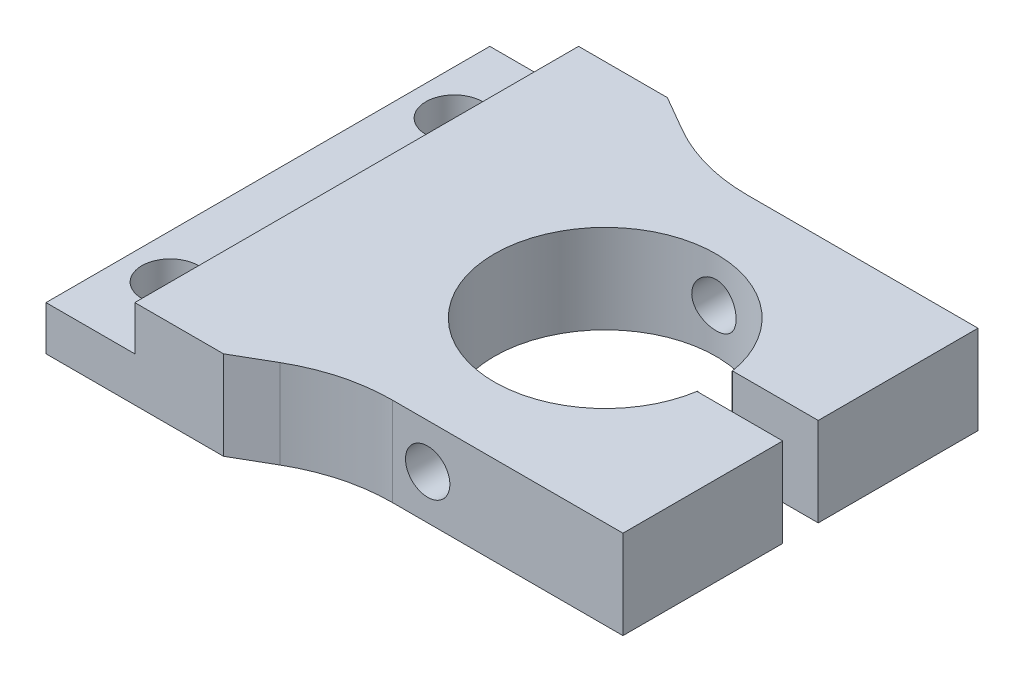
ISO-10303-21;
HEADER;
FILE_DESCRIPTION(('STEP AP214'),'2;1');
FILE_NAME('part.step','',(''),(''),'','','');
FILE_SCHEMA(('AUTOMOTIVE_DESIGN { 1 0 10303 214 1 1 1 1 }'));
ENDSEC;
DATA;
#1=APPLICATION_CONTEXT('core data for automotive mechanical design processes');
#2=APPLICATION_PROTOCOL_DEFINITION('international standard','automotive_design',2000,#1);
#3=PRODUCT_CONTEXT('',#1,'mechanical');
#4=PRODUCT('Part','Part','',(#3));
#5=PRODUCT_RELATED_PRODUCT_CATEGORY('part','',(#4));
#6=PRODUCT_DEFINITION_FORMATION('','',#4);
#7=PRODUCT_DEFINITION_CONTEXT('part definition',#1,'design');
#8=PRODUCT_DEFINITION('design','',#6,#7);
#9=PRODUCT_DEFINITION_SHAPE('','',#8);
#10=(LENGTH_UNIT() NAMED_UNIT(*) SI_UNIT(.MILLI.,.METRE.));
#11=(NAMED_UNIT(*) PLANE_ANGLE_UNIT() SI_UNIT($,.RADIAN.));
#12=(NAMED_UNIT(*) SI_UNIT($,.STERADIAN.) SOLID_ANGLE_UNIT());
#13=UNCERTAINTY_MEASURE_WITH_UNIT(LENGTH_MEASURE(1.E-05),#10,'distance_accuracy_value','');
#14=(GEOMETRIC_REPRESENTATION_CONTEXT(3) GLOBAL_UNCERTAINTY_ASSIGNED_CONTEXT((#13)) GLOBAL_UNIT_ASSIGNED_CONTEXT((#10,
#11,#12)) REPRESENTATION_CONTEXT('',''));
#15=CARTESIAN_POINT('',(0.,0.,0.));
#16=DIRECTION('',(0.,0.,1.));
#17=DIRECTION('',(1.,0.,0.));
#18=AXIS2_PLACEMENT_3D('',#15,#16,#17);
#19=CARTESIAN_POINT('',(30.,5.,-12.5));
#20=DIRECTION('',(-1.,0.,0.));
#21=DIRECTION('',(0.,0.,1.));
#22=AXIS2_PLACEMENT_3D('',#19,#20,#21);
#23=PLANE('',#22);
#24=DIRECTION('',(0.,0.,-1.));
#25=VECTOR('',#24,1.);
#26=CARTESIAN_POINT('',(30.,0.,-12.5));
#27=LINE('',#26,#25);
#28=CARTESIAN_POINT('',(30.,0.,10.));
#29=VERTEX_POINT('',#28);
#30=CARTESIAN_POINT('',(30.,0.,0.999999999999999));
#31=VERTEX_POINT('',#30);
#32=EDGE_CURVE('E209',#29,#31,#27,.T.);
#33=ORIENTED_EDGE('',*,*,#32,.T.);
#34=DIRECTION('',(0.,1.,0.));
#35=VECTOR('',#34,1.);
#36=CARTESIAN_POINT('',(30.,-5.,0.999999999999999));
#37=LINE('',#36,#35);
#38=CARTESIAN_POINT('',(30.,5.,0.999999999999999));
#39=VERTEX_POINT('',#38);
#40=EDGE_CURVE('E422',#31,#39,#37,.T.);
#41=ORIENTED_EDGE('',*,*,#40,.T.);
#42=DIRECTION('',(0.,0.,-1.));
#43=VECTOR('',#42,1.);
#44=CARTESIAN_POINT('',(30.,5.,-12.5));
#45=LINE('',#44,#43);
#46=CARTESIAN_POINT('',(30.,5.,10.));
#47=VERTEX_POINT('',#46);
#48=EDGE_CURVE('E193',#47,#39,#45,.T.);
#49=ORIENTED_EDGE('',*,*,#48,.F.);
#50=DIRECTION('',(0.,1.,0.));
#51=VECTOR('',#50,1.);
#52=CARTESIAN_POINT('',(30.,0.,10.));
#53=LINE('',#52,#51);
#54=EDGE_CURVE('E344',#29,#47,#53,.T.);
#55=ORIENTED_EDGE('',*,*,#54,.F.);
#56=EDGE_LOOP('',(#33,#41,#49,#55));
#57=FACE_BOUND('',#56,.T.);
#58=ADVANCED_FACE('F34',(#57),#23,.F.);
#59=CARTESIAN_POINT('',(0.,5.,12.5));
#60=DIRECTION('',(1.,0.,0.));
#61=DIRECTION('',(0.,0.,-1.));
#62=AXIS2_PLACEMENT_3D('',#59,#60,#61);
#63=PLANE('',#62);
#64=DIRECTION('',(0.,0.,1.));
#65=VECTOR('',#64,1.);
#66=CARTESIAN_POINT('',(0.,2.5,-12.5));
#67=LINE('',#66,#65);
#68=CARTESIAN_POINT('',(0.,2.5,-12.5));
#69=VERTEX_POINT('',#68);
#70=CARTESIAN_POINT('',(0.,2.5,12.5));
#71=VERTEX_POINT('',#70);
#72=EDGE_CURVE('E386',#69,#71,#67,.T.);
#73=ORIENTED_EDGE('',*,*,#72,.F.);
#74=DIRECTION('',(0.,-1.,0.));
#75=VECTOR('',#74,1.);
#76=CARTESIAN_POINT('',(0.,5.,-12.5));
#77=LINE('',#76,#75);
#78=CARTESIAN_POINT('',(0.,0.,-12.5));
#79=VERTEX_POINT('',#78);
#80=EDGE_CURVE('E217',#69,#79,#77,.T.);
#81=ORIENTED_EDGE('',*,*,#80,.T.);
#82=DIRECTION('',(0.,0.,1.));
#83=VECTOR('',#82,1.);
#84=CARTESIAN_POINT('',(0.,0.,12.5));
#85=LINE('',#84,#83);
#86=CARTESIAN_POINT('',(0.,0.,12.5));
#87=VERTEX_POINT('',#86);
#88=EDGE_CURVE('E198',#79,#87,#85,.T.);
#89=ORIENTED_EDGE('',*,*,#88,.T.);
#90=DIRECTION('',(0.,-1.,0.));
#91=VECTOR('',#90,1.);
#92=CARTESIAN_POINT('',(0.,5.,12.5));
#93=LINE('',#92,#91);
#94=EDGE_CURVE('E203',#71,#87,#93,.T.);
#95=ORIENTED_EDGE('',*,*,#94,.F.);
#96=EDGE_LOOP('',(#73,#81,#89,#95));
#97=FACE_BOUND('',#96,.T.);
#98=ADVANCED_FACE('F300',(#97),#63,.F.);
#99=CARTESIAN_POINT('',(30.,5.,12.5));
#100=DIRECTION('',(0.,0.,-1.));
#101=DIRECTION('',(-1.,0.,0.));
#102=AXIS2_PLACEMENT_3D('',#99,#100,#101);
#103=PLANE('',#102);
#104=DIRECTION('',(1.,0.,0.));
#105=VECTOR('',#104,1.);
#106=CARTESIAN_POINT('',(30.,0.,12.5));
#107=LINE('',#106,#105);
#108=CARTESIAN_POINT('',(10.,0.,12.5));
#109=VERTEX_POINT('',#108);
#110=EDGE_CURVE('E204',#87,#109,#107,.T.);
#111=ORIENTED_EDGE('',*,*,#110,.T.);
#112=DIRECTION('',(0.,1.,0.));
#113=VECTOR('',#112,1.);
#114=CARTESIAN_POINT('',(10.,0.,12.5));
#115=LINE('',#114,#113);
#116=CARTESIAN_POINT('',(10.,5.,12.5));
#117=VERTEX_POINT('',#116);
#118=EDGE_CURVE('E343',#109,#117,#115,.T.);
#119=ORIENTED_EDGE('',*,*,#118,.T.);
#120=DIRECTION('',(1.,0.,0.));
#121=VECTOR('',#120,1.);
#122=CARTESIAN_POINT('',(30.,5.,12.5));
#123=LINE('',#122,#121);
#124=CARTESIAN_POINT('',(5.,5.,12.5));
#125=VERTEX_POINT('',#124);
#126=EDGE_CURVE('E194',#125,#117,#123,.T.);
#127=ORIENTED_EDGE('',*,*,#126,.F.);
#128=DIRECTION('',(0.,1.,0.));
#129=VECTOR('',#128,1.);
#130=CARTESIAN_POINT('',(5.,2.5,12.5));
#131=LINE('',#130,#129);
#132=CARTESIAN_POINT('',(5.,2.5,12.5));
#133=VERTEX_POINT('',#132);
#134=EDGE_CURVE('E396',#133,#125,#131,.T.);
#135=ORIENTED_EDGE('',*,*,#134,.F.);
#136=DIRECTION('',(1.,0.,0.));
#137=VECTOR('',#136,1.);
#138=CARTESIAN_POINT('',(0.,2.5,12.5));
#139=LINE('',#138,#137);
#140=EDGE_CURVE('E388',#71,#133,#139,.T.);
#141=ORIENTED_EDGE('',*,*,#140,.F.);
#142=ORIENTED_EDGE('',*,*,#94,.T.);
#143=EDGE_LOOP('',(#111,#119,#127,#135,#141,#142));
#144=FACE_BOUND('',#143,.T.);
#145=ADVANCED_FACE('F306',(#144),#103,.F.);
#146=CARTESIAN_POINT('',(30.,5.,-0.999999999999999));
#147=VERTEX_POINT('',#146);
#148=CARTESIAN_POINT('',(30.,5.,-10.));
#149=VERTEX_POINT('',#148);
#150=EDGE_CURVE('E183',#147,#149,#45,.T.);
#151=ORIENTED_EDGE('',*,*,#150,.F.);
#152=DIRECTION('',(0.,1.,0.));
#153=VECTOR('',#152,1.);
#154=CARTESIAN_POINT('',(30.,-5.,-0.999999999999999));
#155=LINE('',#154,#153);
#156=CARTESIAN_POINT('',(30.,0.,-0.999999999999999));
#157=VERTEX_POINT('',#156);
#158=EDGE_CURVE('E165',#157,#147,#155,.T.);
#159=ORIENTED_EDGE('',*,*,#158,.F.);
#160=CARTESIAN_POINT('',(30.,0.,-10.));
#161=VERTEX_POINT('',#160);
#162=EDGE_CURVE('E207',#157,#161,#27,.T.);
#163=ORIENTED_EDGE('',*,*,#162,.T.);
#164=DIRECTION('',(0.,1.,0.));
#165=VECTOR('',#164,1.);
#166=CARTESIAN_POINT('',(30.,0.,-10.));
#167=LINE('',#166,#165);
#168=EDGE_CURVE('E192',#161,#149,#167,.T.);
#169=ORIENTED_EDGE('',*,*,#168,.T.);
#170=EDGE_LOOP('',(#151,#159,#163,#169));
#171=FACE_BOUND('',#170,.T.);
#172=ADVANCED_FACE('F190',(#171),#23,.F.);
#173=CARTESIAN_POINT('',(0.,5.,-12.5));
#174=DIRECTION('',(0.,0.,1.));
#175=DIRECTION('',(1.,0.,0.));
#176=AXIS2_PLACEMENT_3D('',#173,#174,#175);
#177=PLANE('',#176);
#178=DIRECTION('',(-1.,0.,0.));
#179=VECTOR('',#178,1.);
#180=CARTESIAN_POINT('',(0.,5.,-12.5));
#181=LINE('',#180,#179);
#182=CARTESIAN_POINT('',(10.,5.,-12.5));
#183=VERTEX_POINT('',#182);
#184=CARTESIAN_POINT('',(4.99999999999999,5.,-12.5));
#185=VERTEX_POINT('',#184);
#186=EDGE_CURVE('E196',#183,#185,#181,.T.);
#187=ORIENTED_EDGE('',*,*,#186,.F.);
#188=DIRECTION('',(0.,1.,0.));
#189=VECTOR('',#188,1.);
#190=CARTESIAN_POINT('',(10.,0.,-12.5));
#191=LINE('',#190,#189);
#192=CARTESIAN_POINT('',(10.,0.,-12.5));
#193=VERTEX_POINT('',#192);
#194=EDGE_CURVE('E363',#193,#183,#191,.T.);
#195=ORIENTED_EDGE('',*,*,#194,.F.);
#196=DIRECTION('',(-1.,0.,0.));
#197=VECTOR('',#196,1.);
#198=CARTESIAN_POINT('',(0.,0.,-12.5));
#199=LINE('',#198,#197);
#200=EDGE_CURVE('E212',#193,#79,#199,.T.);
#201=ORIENTED_EDGE('',*,*,#200,.T.);
#202=ORIENTED_EDGE('',*,*,#80,.F.);
#203=DIRECTION('',(-1.,0.,0.));
#204=VECTOR('',#203,1.);
#205=CARTESIAN_POINT('',(0.,2.5,-12.5));
#206=LINE('',#205,#204);
#207=CARTESIAN_POINT('',(4.99999999999999,2.5,-12.5));
#208=VERTEX_POINT('',#207);
#209=EDGE_CURVE('E394',#208,#69,#206,.T.);
#210=ORIENTED_EDGE('',*,*,#209,.F.);
#211=DIRECTION('',(0.,1.,0.));
#212=VECTOR('',#211,1.);
#213=CARTESIAN_POINT('',(4.99999999999999,2.5,-12.5));
#214=LINE('',#213,#212);
#215=EDGE_CURVE('E208',#208,#185,#214,.T.);
#216=ORIENTED_EDGE('',*,*,#215,.T.);
#217=EDGE_LOOP('',(#187,#195,#201,#202,#210,#216));
#218=FACE_BOUND('',#217,.T.);
#219=ADVANCED_FACE('F312',(#218),#177,.F.);
#220=CARTESIAN_POINT('',(0.,5.,0.));
#221=DIRECTION('',(0.,-1.,0.));
#222=DIRECTION('',(0.,0.,-1.));
#223=AXIS2_PLACEMENT_3D('',#220,#221,#222);
#224=PLANE('',#223);
#225=ORIENTED_EDGE('',*,*,#48,.T.);
#226=DIRECTION('',(1.,0.,0.));
#227=VECTOR('',#226,1.);
#228=CARTESIAN_POINT('',(25.1767426076679,5.,1.));
#229=LINE('',#228,#227);
#230=CARTESIAN_POINT('',(25.1767426076679,5.,1.));
#231=VERTEX_POINT('',#230);
#232=EDGE_CURVE('E178',#231,#39,#229,.T.);
#233=ORIENTED_EDGE('',*,*,#232,.F.);
#234=DIRECTION('',(0.,0.,1.));
#235=VECTOR('',#234,1.);
#236=CARTESIAN_POINT('',(25.1767426076679,5.,-1.));
#237=LINE('',#236,#235);
#238=CARTESIAN_POINT('',(25.1767426076679,5.,0.95412303117575));
#239=VERTEX_POINT('',#238);
#240=EDGE_CURVE('E187',#239,#231,#237,.T.);
#241=ORIENTED_EDGE('',*,*,#240,.F.);
#242=CARTESIAN_POINT('',(19.,5.,0.));
#243=DIRECTION('',(0.,1.,0.));
#244=DIRECTION('',(0.,0.,1.));
#245=AXIS2_PLACEMENT_3D('',#242,#243,#244);
#246=CIRCLE('',#245,6.25);
#247=CARTESIAN_POINT('',(25.1767426076679,5.,-0.95412303117575));
#248=VERTEX_POINT('',#247);
#249=EDGE_CURVE('E379',#248,#239,#246,.T.);
#250=ORIENTED_EDGE('',*,*,#249,.F.);
#251=CARTESIAN_POINT('',(25.1767426076679,5.,-1.));
#252=VERTEX_POINT('',#251);
#253=EDGE_CURVE('E186',#252,#248,#237,.T.);
#254=ORIENTED_EDGE('',*,*,#253,.F.);
#255=DIRECTION('',(-1.,0.,0.));
#256=VECTOR('',#255,1.);
#257=CARTESIAN_POINT('',(30.,5.,-0.999999999999999));
#258=LINE('',#257,#256);
#259=EDGE_CURVE('E169',#147,#252,#258,.T.);
#260=ORIENTED_EDGE('',*,*,#259,.F.);
#261=ORIENTED_EDGE('',*,*,#150,.T.);
#262=DIRECTION('',(1.,0.,0.));
#263=VECTOR('',#262,1.);
#264=CARTESIAN_POINT('',(14.3301270189223,5.,-10.));
#265=LINE('',#264,#263);
#266=CARTESIAN_POINT('',(17.0096189432334,5.,-10.));
#267=VERTEX_POINT('',#266);
#268=EDGE_CURVE('E361',#267,#149,#265,.T.);
#269=ORIENTED_EDGE('',*,*,#268,.F.);
#270=CARTESIAN_POINT('',(17.0096189432334,5.,-20.));
#271=DIRECTION('',(0.,-1.,0.));
#272=DIRECTION('',(0.,0.,-1.));
#273=AXIS2_PLACEMENT_3D('',#270,#271,#272);
#274=CIRCLE('',#273,10.);
#275=CARTESIAN_POINT('',(12.0096189432335,5.,-11.3397459621556));
#276=VERTEX_POINT('',#275);
#277=EDGE_CURVE('E48',#267,#276,#274,.T.);
#278=ORIENTED_EDGE('',*,*,#277,.T.);
#279=DIRECTION('',(0.866025403784442,0.,0.499999999999994));
#280=VECTOR('',#279,1.);
#281=CARTESIAN_POINT('',(10.,5.,-12.5));
#282=LINE('',#281,#280);
#283=EDGE_CURVE('E356',#183,#276,#282,.T.);
#284=ORIENTED_EDGE('',*,*,#283,.F.);
#285=ORIENTED_EDGE('',*,*,#186,.T.);
#286=DIRECTION('',(0.,0.,-1.));
#287=VECTOR('',#286,1.);
#288=CARTESIAN_POINT('',(4.99999999999999,5.,-12.5));
#289=LINE('',#288,#287);
#290=EDGE_CURVE('E385',#125,#185,#289,.T.);
#291=ORIENTED_EDGE('',*,*,#290,.F.);
#292=ORIENTED_EDGE('',*,*,#126,.T.);
#293=DIRECTION('',(-0.866025403784441,0.,0.499999999999995));
#294=VECTOR('',#293,1.);
#295=CARTESIAN_POINT('',(14.3301270189223,5.,10.));
#296=LINE('',#295,#294);
#297=CARTESIAN_POINT('',(12.0096189432335,5.,11.3397459621556));
#298=VERTEX_POINT('',#297);
#299=EDGE_CURVE('E347',#298,#117,#296,.T.);
#300=ORIENTED_EDGE('',*,*,#299,.F.);
#301=CARTESIAN_POINT('',(17.0096189432335,5.,20.));
#302=DIRECTION('',(0.,-1.,0.));
#303=DIRECTION('',(0.,0.,-1.));
#304=AXIS2_PLACEMENT_3D('',#301,#302,#303);
#305=CIRCLE('',#304,10.);
#306=CARTESIAN_POINT('',(17.0096189432335,5.,10.));
#307=VERTEX_POINT('',#306);
#308=EDGE_CURVE('E238',#298,#307,#305,.T.);
#309=ORIENTED_EDGE('',*,*,#308,.T.);
#310=DIRECTION('',(-1.,0.,0.));
#311=VECTOR('',#310,1.);
#312=CARTESIAN_POINT('',(30.,5.,10.));
#313=LINE('',#312,#311);
#314=EDGE_CURVE('E351',#47,#307,#313,.T.);
#315=ORIENTED_EDGE('',*,*,#314,.F.);
#316=EDGE_LOOP('',(#225,#233,#241,#250,#254,#260,#261,#269,#278,#284,#285,#291,#292,#300,#309,#315));
#317=FACE_BOUND('',#316,.T.);
#318=ADVANCED_FACE('F182',(#317),#224,.F.);
#319=CARTESIAN_POINT('',(0.,0.,0.));
#320=DIRECTION('',(0.,-1.,0.));
#321=DIRECTION('',(0.,0.,-1.));
#322=AXIS2_PLACEMENT_3D('',#319,#320,#321);
#323=PLANE('',#322);
#324=DIRECTION('',(-1.,0.,0.));
#325=VECTOR('',#324,1.);
#326=CARTESIAN_POINT('',(0.,0.,1.));
#327=LINE('',#326,#325);
#328=CARTESIAN_POINT('',(25.1767426076679,0.,1.));
#329=VERTEX_POINT('',#328);
#330=EDGE_CURVE('E227',#31,#329,#327,.T.);
#331=ORIENTED_EDGE('',*,*,#330,.F.);
#332=ORIENTED_EDGE('',*,*,#32,.F.);
#333=DIRECTION('',(-1.,0.,0.));
#334=VECTOR('',#333,1.);
#335=CARTESIAN_POINT('',(30.,0.,10.));
#336=LINE('',#335,#334);
#337=CARTESIAN_POINT('',(17.0096189432335,0.,10.));
#338=VERTEX_POINT('',#337);
#339=EDGE_CURVE('E340',#29,#338,#336,.T.);
#340=ORIENTED_EDGE('',*,*,#339,.T.);
#341=CARTESIAN_POINT('',(17.0096189432335,0.,20.));
#342=DIRECTION('',(0.,-1.,0.));
#343=DIRECTION('',(0.,0.,-1.));
#344=AXIS2_PLACEMENT_3D('',#341,#342,#343);
#345=CIRCLE('',#344,10.);
#346=CARTESIAN_POINT('',(12.0096189432335,0.,11.3397459621556));
#347=VERTEX_POINT('',#346);
#348=EDGE_CURVE('E240',#338,#347,#345,.F.);
#349=ORIENTED_EDGE('',*,*,#348,.T.);
#350=DIRECTION('',(-0.866025403784441,0.,0.499999999999995));
#351=VECTOR('',#350,1.);
#352=CARTESIAN_POINT('',(14.3301270189223,0.,10.));
#353=LINE('',#352,#351);
#354=EDGE_CURVE('E337',#347,#109,#353,.T.);
#355=ORIENTED_EDGE('',*,*,#354,.T.);
#356=ORIENTED_EDGE('',*,*,#110,.F.);
#357=ORIENTED_EDGE('',*,*,#88,.F.);
#358=ORIENTED_EDGE('',*,*,#200,.F.);
#359=DIRECTION('',(0.866025403784442,0.,0.499999999999994));
#360=VECTOR('',#359,1.);
#361=CARTESIAN_POINT('',(10.,0.,-12.5));
#362=LINE('',#361,#360);
#363=CARTESIAN_POINT('',(12.0096189432335,0.,-11.3397459621556));
#364=VERTEX_POINT('',#363);
#365=EDGE_CURVE('E358',#193,#364,#362,.T.);
#366=ORIENTED_EDGE('',*,*,#365,.T.);
#367=CARTESIAN_POINT('',(17.0096189432334,0.,-20.));
#368=DIRECTION('',(0.,-1.,0.));
#369=DIRECTION('',(0.,0.,-1.));
#370=AXIS2_PLACEMENT_3D('',#367,#368,#369);
#371=CIRCLE('',#370,10.);
#372=CARTESIAN_POINT('',(17.0096189432334,0.,-10.));
#373=VERTEX_POINT('',#372);
#374=EDGE_CURVE('E11',#364,#373,#371,.F.);
#375=ORIENTED_EDGE('',*,*,#374,.T.);
#376=DIRECTION('',(1.,0.,0.));
#377=VECTOR('',#376,1.);
#378=CARTESIAN_POINT('',(14.3301270189223,0.,-10.));
#379=LINE('',#378,#377);
#380=EDGE_CURVE('E360',#373,#161,#379,.T.);
#381=ORIENTED_EDGE('',*,*,#380,.T.);
#382=ORIENTED_EDGE('',*,*,#162,.F.);
#383=DIRECTION('',(1.,0.,0.));
#384=VECTOR('',#383,1.);
#385=CARTESIAN_POINT('',(0.,0.,-1.));
#386=LINE('',#385,#384);
#387=CARTESIAN_POINT('',(25.1767426076679,0.,-1.));
#388=VERTEX_POINT('',#387);
#389=EDGE_CURVE('E172',#388,#157,#386,.T.);
#390=ORIENTED_EDGE('',*,*,#389,.F.);
#391=DIRECTION('',(0.,0.,-1.));
#392=VECTOR('',#391,1.);
#393=CARTESIAN_POINT('',(25.1767426076679,0.,0.));
#394=LINE('',#393,#392);
#395=CARTESIAN_POINT('',(25.1767426076679,0.,-0.95412303117575));
#396=VERTEX_POINT('',#395);
#397=EDGE_CURVE('E419',#396,#388,#394,.T.);
#398=ORIENTED_EDGE('',*,*,#397,.F.);
#399=CARTESIAN_POINT('',(19.,0.,0.));
#400=DIRECTION('',(0.,1.,0.));
#401=DIRECTION('',(0.,0.,1.));
#402=AXIS2_PLACEMENT_3D('',#399,#400,#401);
#403=CIRCLE('',#402,6.25);
#404=CARTESIAN_POINT('',(25.1767426076679,0.,0.95412303117575));
#405=VERTEX_POINT('',#404);
#406=EDGE_CURVE('E382',#396,#405,#403,.T.);
#407=ORIENTED_EDGE('',*,*,#406,.T.);
#408=EDGE_CURVE('E354',#329,#405,#394,.T.);
#409=ORIENTED_EDGE('',*,*,#408,.F.);
#410=EDGE_LOOP('',(#331,#332,#340,#349,#355,#356,#357,#358,#366,#375,#381,#382,#390,#398,#407,#409));
#411=FACE_BOUND('',#410,.T.);
#412=CARTESIAN_POINT('',(2.5,0.,-8.));
#413=DIRECTION('',(0.,-1.,0.));
#414=DIRECTION('',(0.,0.,-1.));
#415=AXIS2_PLACEMENT_3D('',#412,#413,#414);
#416=CIRCLE('',#415,1.6);
#417=CARTESIAN_POINT('',(2.5,0.,-9.6));
#418=VERTEX_POINT('',#417);
#419=EDGE_CURVE('E367',#418,#418,#416,.T.);
#420=ORIENTED_EDGE('',*,*,#419,.F.);
#421=EDGE_LOOP('',(#420));
#422=FACE_BOUND('',#421,.T.);
#423=CARTESIAN_POINT('',(2.5,0.,8.));
#424=DIRECTION('',(0.,-1.,0.));
#425=DIRECTION('',(0.,0.,-1.));
#426=AXIS2_PLACEMENT_3D('',#423,#424,#425);
#427=CIRCLE('',#426,1.6);
#428=CARTESIAN_POINT('',(2.5,0.,6.4));
#429=VERTEX_POINT('',#428);
#430=EDGE_CURVE('E374',#429,#429,#427,.T.);
#431=ORIENTED_EDGE('',*,*,#430,.F.);
#432=EDGE_LOOP('',(#431));
#433=FACE_BOUND('',#432,.T.);
#434=ADVANCED_FACE('F334',(#411,#422,#433),#323,.T.);
#435=CARTESIAN_POINT('',(4.99999999999999,2.5,-12.5));
#436=DIRECTION('',(1.,0.,0.));
#437=DIRECTION('',(0.,0.,-1.));
#438=AXIS2_PLACEMENT_3D('',#435,#436,#437);
#439=PLANE('',#438);
#440=ORIENTED_EDGE('',*,*,#290,.T.);
#441=ORIENTED_EDGE('',*,*,#215,.F.);
#442=DIRECTION('',(0.,0.,-1.));
#443=VECTOR('',#442,1.);
#444=CARTESIAN_POINT('',(4.99999999999999,2.5,-12.5));
#445=LINE('',#444,#443);
#446=EDGE_CURVE('E391',#133,#208,#445,.T.);
#447=ORIENTED_EDGE('',*,*,#446,.F.);
#448=ORIENTED_EDGE('',*,*,#134,.T.);
#449=EDGE_LOOP('',(#440,#441,#447,#448));
#450=FACE_BOUND('',#449,.T.);
#451=ADVANCED_FACE('F403',(#450),#439,.F.);
#452=CARTESIAN_POINT('',(0.,2.5,0.));
#453=DIRECTION('',(0.,1.,0.));
#454=DIRECTION('',(0.,0.,1.));
#455=AXIS2_PLACEMENT_3D('',#452,#453,#454);
#456=PLANE('',#455);
#457=CARTESIAN_POINT('',(2.5,2.5,-8.));
#458=DIRECTION('',(0.,1.,0.));
#459=DIRECTION('',(0.,0.,1.));
#460=AXIS2_PLACEMENT_3D('',#457,#458,#459);
#461=CIRCLE('',#460,1.6);
#462=CARTESIAN_POINT('',(2.5,2.5,-6.4));
#463=VERTEX_POINT('',#462);
#464=EDGE_CURVE('E371',#463,#463,#461,.T.);
#465=ORIENTED_EDGE('',*,*,#464,.F.);
#466=EDGE_LOOP('',(#465));
#467=FACE_BOUND('',#466,.T.);
#468=CARTESIAN_POINT('',(2.5,2.5,8.));
#469=DIRECTION('',(0.,1.,0.));
#470=DIRECTION('',(0.,0.,1.));
#471=AXIS2_PLACEMENT_3D('',#468,#469,#470);
#472=CIRCLE('',#471,1.6);
#473=CARTESIAN_POINT('',(2.5,2.5,9.6));
#474=VERTEX_POINT('',#473);
#475=EDGE_CURVE('E377',#474,#474,#472,.T.);
#476=ORIENTED_EDGE('',*,*,#475,.F.);
#477=EDGE_LOOP('',(#476));
#478=FACE_BOUND('',#477,.T.);
#479=ORIENTED_EDGE('',*,*,#72,.T.);
#480=ORIENTED_EDGE('',*,*,#140,.T.);
#481=ORIENTED_EDGE('',*,*,#446,.T.);
#482=ORIENTED_EDGE('',*,*,#209,.T.);
#483=EDGE_LOOP('',(#479,#480,#481,#482));
#484=FACE_BOUND('',#483,.T.);
#485=ADVANCED_FACE('F295',(#467,#478,#484),#456,.T.);
#486=CARTESIAN_POINT('',(19.,5.,0.));
#487=DIRECTION('',(0.,1.,0.));
#488=DIRECTION('',(0.,0.,1.));
#489=AXIS2_PLACEMENT_3D('',#486,#487,#488);
#490=CYLINDRICAL_SURFACE('',#489,6.25);
#491=CARTESIAN_POINT('',(20.25,2.5,-6.12372435695794));
#492=CARTESIAN_POINT('',(20.249997432345,2.43054453064753,-6.12372573804916));
#493=CARTESIAN_POINT('',(20.2441914646546,2.36105672086688,-6.12491885433641));
#494=CARTESIAN_POINT('',(20.2211403544854,2.22404686860199,-6.12955539231579));
#495=CARTESIAN_POINT('',(20.203886058839,2.15652644421116,-6.13300061457916));
#496=CARTESIAN_POINT('',(20.1584947282722,2.02545337079634,-6.14173592125445));
#497=CARTESIAN_POINT('',(20.1303685176901,1.96189684808134,-6.14702417019141));
#498=CARTESIAN_POINT('',(20.0640613845888,1.84040644413173,-6.15884749358026));
#499=CARTESIAN_POINT('',(20.0258810232516,1.78247224932841,-6.16538249843768));
#500=CARTESIAN_POINT('',(19.9399738445666,1.67304874518188,-6.1790662461585));
#501=CARTESIAN_POINT('',(19.8921320698916,1.62165051514482,-6.18622172296031));
#502=CARTESIAN_POINT('',(19.7885084862767,1.52755308302649,-6.20028090378775));
#503=CARTESIAN_POINT('',(19.7327261212225,1.48485449072857,-6.20718459013681));
#504=CARTESIAN_POINT('',(19.6142016949053,1.40901497796437,-6.22003495521809));
#505=CARTESIAN_POINT('',(19.5514032095903,1.37596060772919,-6.225972768019));
#506=CARTESIAN_POINT('',(19.4210051879841,1.32090632868985,-6.23614671104577));
#507=CARTESIAN_POINT('',(19.3534061017757,1.29890538512377,-6.24038300055159));
#508=CARTESIAN_POINT('',(19.2162709665981,1.26686600797547,-6.24662900860513));
#509=CARTESIAN_POINT('',(19.1467721740185,1.25667377803625,-6.24866732860156));
#510=CARTESIAN_POINT('',(19.0070232105469,1.24806131020211,-6.25038651479507));
#511=CARTESIAN_POINT('',(18.9367731127102,1.24963993794273,-6.25006760815949));
#512=CARTESIAN_POINT('',(18.7985724990705,1.26440772526945,-6.24713043585644));
#513=CARTESIAN_POINT('',(18.7306034821269,1.27743122145982,-6.24454497957298));
#514=CARTESIAN_POINT('',(18.5978354667746,1.31445629057362,-6.23740221449261));
#515=CARTESIAN_POINT('',(18.5330365953161,1.33845830273985,-6.23284482680049));
#516=CARTESIAN_POINT('',(18.4079756709989,1.39691255018409,-6.22221620024948));
#517=CARTESIAN_POINT('',(18.3477447823326,1.43142968888112,-6.21613560219029));
#518=CARTESIAN_POINT('',(18.2338686926753,1.50988634654576,-6.20313086842232));
#519=CARTESIAN_POINT('',(18.1802242505937,1.55382694971315,-6.19620663569028));
#520=CARTESIAN_POINT('',(18.0800607111832,1.65079202763559,-6.18213705455574));
#521=CARTESIAN_POINT('',(18.033682104283,1.70396148341199,-6.17498995571895));
#522=CARTESIAN_POINT('',(17.950476883529,1.81739555306344,-6.16139464498451));
#523=CARTESIAN_POINT('',(17.9136504503403,1.877660301104,-6.15494644630685));
#524=CARTESIAN_POINT('',(17.8505464814976,2.00377603977726,-6.14347559341155));
#525=CARTESIAN_POINT('',(17.8242916902779,2.06963870954958,-6.13845601954436));
#526=CARTESIAN_POINT('',(17.7832620729655,2.20496415465499,-6.13045595401591));
#527=CARTESIAN_POINT('',(17.7684857506792,2.27442645952386,-6.12747519660535));
#528=CARTESIAN_POINT('',(17.7510424924549,2.41370607249881,-6.12394349084785));
#529=CARTESIAN_POINT('',(17.7481726763776,2.48349696788793,-6.12335183821443));
#530=CARTESIAN_POINT('',(17.7540779646116,2.6225602789996,-6.12455607111067));
#531=CARTESIAN_POINT('',(17.7628524085969,2.69183272389858,-6.12635182125485));
#532=CARTESIAN_POINT('',(17.7916222399073,2.82721080036529,-6.13209040618643));
#533=CARTESIAN_POINT('',(17.8115092239509,2.8933404287947,-6.13601248768121));
#534=CARTESIAN_POINT('',(17.8618237058644,3.02132909878592,-6.14554361689581));
#535=CARTESIAN_POINT('',(17.8922520720335,3.08318778804465,-6.15115280357837));
#536=CARTESIAN_POINT('',(17.9632448222305,3.2017663874377,-6.16351757452549));
#537=CARTESIAN_POINT('',(18.0039361525216,3.25840880787603,-6.17028714831129));
#538=CARTESIAN_POINT('',(18.0941305347341,3.36413539000114,-6.18417154783296));
#539=CARTESIAN_POINT('',(18.1436344935693,3.41321877281156,-6.19128640904772));
#540=CARTESIAN_POINT('',(18.2509596581276,3.50320319898196,-6.20519182336519));
#541=CARTESIAN_POINT('',(18.308896876338,3.54396706831249,-6.21197572135855));
#542=CARTESIAN_POINT('',(18.4309151292066,3.61518235187447,-6.22433909535775));
#543=CARTESIAN_POINT('',(18.4949959057081,3.64563419918097,-6.22991862194013));
#544=CARTESIAN_POINT('',(18.62712164897,3.69516108968328,-6.23921617576333));
#545=CARTESIAN_POINT('',(18.6951416581524,3.71430064778281,-6.24294473928255));
#546=CARTESIAN_POINT('',(18.8335131816501,3.7408640595798,-6.24816544922075));
#547=CARTESIAN_POINT('',(18.903864414111,3.74828932434459,-6.24965786499804));
#548=CARTESIAN_POINT('',(19.0435911173795,3.7511587262036,-6.25023175567651));
#549=CARTESIAN_POINT('',(19.1129622651769,3.74680910057026,-6.24935473186689));
#550=CARTESIAN_POINT('',(19.2499637891446,3.72670756181523,-6.24537554450397));
#551=CARTESIAN_POINT('',(19.3175941871921,3.7109557920649,-6.24227340892939));
#552=CARTESIAN_POINT('',(19.4490659371814,3.66858875988544,-6.23419372956251));
#553=CARTESIAN_POINT('',(19.5129155540503,3.64199827733601,-6.2292204655989));
#554=CARTESIAN_POINT('',(19.6352765252324,3.57873469833637,-6.21793402654228));
#555=CARTESIAN_POINT('',(19.6937874572093,3.54206080512035,-6.21162074557347));
#556=CARTESIAN_POINT('',(19.8048298626329,3.45897576617239,-6.19821998947335));
#557=CARTESIAN_POINT('',(19.8572496451456,3.41241707951653,-6.19112166777678));
#558=CARTESIAN_POINT('',(19.953603272196,3.31118719988027,-6.17701528629528));
#559=CARTESIAN_POINT('',(19.9975351040034,3.25651408816407,-6.17000724828594));
#560=CARTESIAN_POINT('',(20.076115274319,3.13990085412477,-6.15679178437455));
#561=CARTESIAN_POINT('',(20.1106585182997,3.07788879854954,-6.1505937953916));
#562=CARTESIAN_POINT('',(20.1687800616097,2.94883403337538,-6.13981546480556));
#563=CARTESIAN_POINT('',(20.1923683074741,2.8817959516276,-6.13523365671196));
#564=CARTESIAN_POINT('',(20.2233364248178,2.76217193070429,-6.12912101411152));
#565=CARTESIAN_POINT('',(20.2333173731537,2.71026822561068,-6.12710981144576));
#566=CARTESIAN_POINT('',(20.2466500224505,2.60558255680795,-6.12441098072537));
#567=CARTESIAN_POINT('',(20.2500019519526,2.55280062343978,-6.12372330704096));
#568=CARTESIAN_POINT('',(20.25,2.5,-6.12372435695794));
#569=B_SPLINE_CURVE_WITH_KNOTS('',3,(#491,#492,#493,#494,#495,#496,#497,#498,#499,#500,#501,
#502,#503,#504,#505,#506,#507,#508,#509,#510,#511,#512,#513,#514,#515,#516,#517,#518,#519,#520,
#521,#522,#523,#524,#525,#526,#527,#528,#529,#530,#531,#532,#533,#534,#535,#536,#537,#538,#539,
#540,#541,#542,#543,#544,#545,#546,#547,#548,#549,#550,#551,#552,#553,#554,#555,#556,#557,#558,
#559,#560,#561,#562,#563,#564,#565,#566,#567,#568),.UNSPECIFIED.,.T.,.F.,(4,2,2,2,2,2,2,2,2,2,2,
2,2,2,2,2,2,2,2,2,2,2,2,2,2,2,2,2,2,2,2,2,2,2,2,2,2,2,4),(0.,0.208173079820654,
0.416512799074078,0.624645622394438,0.832766831043535,1.04352815682416,1.25430425041147,
1.46691750543683,1.6795108530507,1.88930311100721,2.0990751514218,2.30585987038791,
2.51265286339057,2.72074905274748,2.92886919709452,3.14061683449973,3.35236847650269,
3.5645732896284,3.776750437669,3.9852969725261,4.19383168157395,4.40036677226017,
4.60691887939866,4.81616324715019,5.02542916084629,5.23790752163681,5.45037695784498,
5.6616226697018,5.87284293361402,6.08038771765225,6.28792989205313,6.49500021341182,
6.70208690165222,6.91251440028863,7.12299173609093,7.33573623220668,7.54828718858032,
7.70654754542986,7.86480244602135),.UNSPECIFIED.);
#570=CARTESIAN_POINT('',(20.25,2.5,-6.12372435695794));
#571=VERTEX_POINT('',#570);
#572=EDGE_CURVE('E38',#571,#571,#569,.T.);
#573=ORIENTED_EDGE('',*,*,#572,.T.);
#574=EDGE_LOOP('',(#573));
#575=FACE_BOUND('',#574,.T.);
#576=CARTESIAN_POINT('',(20.25,2.5,6.12372435695794));
#577=CARTESIAN_POINT('',(20.249997432345,2.56945546935247,6.12372573804916));
#578=CARTESIAN_POINT('',(20.2441914646546,2.63894327913311,6.12491885433641));
#579=CARTESIAN_POINT('',(20.2211403544854,2.77595313139801,6.12955539231579));
#580=CARTESIAN_POINT('',(20.203886058839,2.84347355578883,6.13300061457916));
#581=CARTESIAN_POINT('',(20.1584947282722,2.97454662920366,6.14173592125445));
#582=CARTESIAN_POINT('',(20.1303685176901,3.03810315191865,6.14702417019141));
#583=CARTESIAN_POINT('',(20.0640613845888,3.15959355586827,6.15884749358026));
#584=CARTESIAN_POINT('',(20.0258810232516,3.21752775067159,6.16538249843768));
#585=CARTESIAN_POINT('',(19.9399738445666,3.32695125481812,6.1790662461585));
#586=CARTESIAN_POINT('',(19.8921320698916,3.37834948485517,6.18622172296031));
#587=CARTESIAN_POINT('',(19.7885084862767,3.4724469169735,6.20028090378775));
#588=CARTESIAN_POINT('',(19.7327261212225,3.51514550927142,6.20718459013681));
#589=CARTESIAN_POINT('',(19.6142016949053,3.59098502203562,6.22003495521809));
#590=CARTESIAN_POINT('',(19.5514032095903,3.62403939227081,6.225972768019));
#591=CARTESIAN_POINT('',(19.4210051879841,3.67909367131015,6.23614671104577));
#592=CARTESIAN_POINT('',(19.3534061017757,3.70109461487623,6.24038300055159));
#593=CARTESIAN_POINT('',(19.2162709665981,3.73313399202453,6.24662900860513));
#594=CARTESIAN_POINT('',(19.1467721740185,3.74332622196375,6.24866732860156));
#595=CARTESIAN_POINT('',(19.0070232105469,3.75193868979788,6.25038651479507));
#596=CARTESIAN_POINT('',(18.9367731127102,3.75036006205727,6.25006760815949));
#597=CARTESIAN_POINT('',(18.7985724990705,3.73559227473055,6.24713043585644));
#598=CARTESIAN_POINT('',(18.7306034821269,3.72256877854018,6.24454497957298));
#599=CARTESIAN_POINT('',(18.5978354667746,3.68554370942638,6.23740221449261));
#600=CARTESIAN_POINT('',(18.5330365953161,3.66154169726015,6.23284482680049));
#601=CARTESIAN_POINT('',(18.4079756709989,3.60308744981591,6.22221620024948));
#602=CARTESIAN_POINT('',(18.3477447823326,3.56857031111888,6.21613560219029));
#603=CARTESIAN_POINT('',(18.2338686926753,3.49011365345424,6.20313086842232));
#604=CARTESIAN_POINT('',(18.1802242505937,3.44617305028685,6.19620663569028));
#605=CARTESIAN_POINT('',(18.0800607111832,3.3492079723644,6.18213705455574));
#606=CARTESIAN_POINT('',(18.033682104283,3.29603851658801,6.17498995571895));
#607=CARTESIAN_POINT('',(17.950476883529,3.18260444693655,6.16139464498451));
#608=CARTESIAN_POINT('',(17.9136504503403,3.122339698896,6.15494644630685));
#609=CARTESIAN_POINT('',(17.8505464814976,2.99622396022274,6.14347559341155));
#610=CARTESIAN_POINT('',(17.8242916902779,2.93036129045042,6.13845601954436));
#611=CARTESIAN_POINT('',(17.7832620729655,2.79503584534501,6.13045595401591));
#612=CARTESIAN_POINT('',(17.7684857506792,2.72557354047614,6.12747519660535));
#613=CARTESIAN_POINT('',(17.7510424924549,2.58629392750119,6.12394349084785));
#614=CARTESIAN_POINT('',(17.7481726763776,2.51650303211207,6.12335183821443));
#615=CARTESIAN_POINT('',(17.7540779646116,2.37743972100039,6.12455607111067));
#616=CARTESIAN_POINT('',(17.7628524085969,2.30816727610142,6.12635182125485));
#617=CARTESIAN_POINT('',(17.7916222399073,2.17278919963471,6.13209040618643));
#618=CARTESIAN_POINT('',(17.8115092239509,2.1066595712053,6.13601248768121));
#619=CARTESIAN_POINT('',(17.8618237058644,1.97867090121408,6.14554361689581));
#620=CARTESIAN_POINT('',(17.8922520720335,1.91681221195535,6.15115280357837));
#621=CARTESIAN_POINT('',(17.9632448222305,1.7982336125623,6.16351757452549));
#622=CARTESIAN_POINT('',(18.0039361525216,1.74159119212397,6.17028714831129));
#623=CARTESIAN_POINT('',(18.0941305347341,1.63586460999886,6.18417154783296));
#624=CARTESIAN_POINT('',(18.1436344935693,1.58678122718843,6.19128640904772));
#625=CARTESIAN_POINT('',(18.2509596581276,1.49679680101803,6.20519182336519));
#626=CARTESIAN_POINT('',(18.308896876338,1.45603293168751,6.21197572135855));
#627=CARTESIAN_POINT('',(18.4309151292066,1.38481764812553,6.22433909535775));
#628=CARTESIAN_POINT('',(18.4949959057081,1.35436580081903,6.22991862194013));
#629=CARTESIAN_POINT('',(18.62712164897,1.30483891031671,6.23921617576333));
#630=CARTESIAN_POINT('',(18.6951416581524,1.28569935221719,6.24294473928255));
#631=CARTESIAN_POINT('',(18.8335131816501,1.2591359404202,6.24816544922075));
#632=CARTESIAN_POINT('',(18.903864414111,1.2517106756554,6.24965786499804));
#633=CARTESIAN_POINT('',(19.0435911173795,1.2488412737964,6.25023175567651));
#634=CARTESIAN_POINT('',(19.1129622651769,1.25319089942974,6.24935473186689));
#635=CARTESIAN_POINT('',(19.2499637891446,1.27329243818477,6.24537554450397));
#636=CARTESIAN_POINT('',(19.3175941871921,1.2890442079351,6.24227340892939));
#637=CARTESIAN_POINT('',(19.4490659371814,1.33141124011456,6.23419372956251));
#638=CARTESIAN_POINT('',(19.5129155540503,1.35800172266399,6.2292204655989));
#639=CARTESIAN_POINT('',(19.6352765252324,1.42126530166363,6.21793402654228));
#640=CARTESIAN_POINT('',(19.6937874572093,1.45793919487965,6.21162074557347));
#641=CARTESIAN_POINT('',(19.8048298626329,1.54102423382761,6.19821998947335));
#642=CARTESIAN_POINT('',(19.8572496451456,1.58758292048347,6.19112166777678));
#643=CARTESIAN_POINT('',(19.953603272196,1.68881280011972,6.17701528629528));
#644=CARTESIAN_POINT('',(19.9975351040034,1.74348591183593,6.17000724828594));
#645=CARTESIAN_POINT('',(20.076115274319,1.86009914587522,6.15679178437455));
#646=CARTESIAN_POINT('',(20.1106585182997,1.92211120145046,6.1505937953916));
#647=CARTESIAN_POINT('',(20.1687800616097,2.05116596662462,6.13981546480556));
#648=CARTESIAN_POINT('',(20.1923683074741,2.1182040483724,6.13523365671196));
#649=CARTESIAN_POINT('',(20.2233364248178,2.23782806929571,6.12912101411152));
#650=CARTESIAN_POINT('',(20.2333173731537,2.28973177438932,6.12710981144576));
#651=CARTESIAN_POINT('',(20.2466500224505,2.39441744319205,6.12441098072537));
#652=CARTESIAN_POINT('',(20.2500019519526,2.44719937656021,6.12372330704096));
#653=CARTESIAN_POINT('',(20.25,2.5,6.12372435695794));
#654=B_SPLINE_CURVE_WITH_KNOTS('',3,(#576,#577,#578,#579,#580,#581,#582,#583,#584,#585,#586,
#587,#588,#589,#590,#591,#592,#593,#594,#595,#596,#597,#598,#599,#600,#601,#602,#603,#604,#605,
#606,#607,#608,#609,#610,#611,#612,#613,#614,#615,#616,#617,#618,#619,#620,#621,#622,#623,#624,
#625,#626,#627,#628,#629,#630,#631,#632,#633,#634,#635,#636,#637,#638,#639,#640,#641,#642,#643,
#644,#645,#646,#647,#648,#649,#650,#651,#652,#653),.UNSPECIFIED.,.T.,.F.,(4,2,2,2,2,2,2,2,2,2,2,
2,2,2,2,2,2,2,2,2,2,2,2,2,2,2,2,2,2,2,2,2,2,2,2,2,2,2,4),(0.,0.208173079820654,
0.416512799074078,0.624645622394438,0.832766831043535,1.04352815682416,1.25430425041147,
1.46691750543683,1.6795108530507,1.88930311100721,2.0990751514218,2.30585987038791,
2.51265286339057,2.72074905274748,2.92886919709452,3.14061683449973,3.3523684765027,
3.5645732896284,3.776750437669,3.98529697252611,4.19383168157395,4.40036677226017,
4.60691887939866,4.8161632471502,5.02542916084629,5.23790752163681,5.45037695784498,
5.6616226697018,5.87284293361403,6.08038771765225,6.28792989205313,6.49500021341182,
6.70208690165222,6.91251440028863,7.12299173609093,7.33573623220668,7.54828718858032,
7.70654754542986,7.86480244602135),.UNSPECIFIED.);
#655=CARTESIAN_POINT('',(20.25,2.5,6.12372435695794));
#656=VERTEX_POINT('',#655);
#657=EDGE_CURVE('E242',#656,#656,#654,.T.);
#658=ORIENTED_EDGE('',*,*,#657,.T.);
#659=EDGE_LOOP('',(#658));
#660=FACE_BOUND('',#659,.T.);
#661=ORIENTED_EDGE('',*,*,#249,.T.);
#662=DIRECTION('',(0.,1.,0.));
#663=VECTOR('',#662,1.);
#664=CARTESIAN_POINT('',(25.1767426076679,5.,0.95412303117575));
#665=LINE('',#664,#663);
#666=EDGE_CURVE('E223',#239,#405,#665,.F.);
#667=ORIENTED_EDGE('',*,*,#666,.T.);
#668=ORIENTED_EDGE('',*,*,#406,.F.);
#669=DIRECTION('',(0.,1.,0.));
#670=VECTOR('',#669,1.);
#671=CARTESIAN_POINT('',(25.1767426076679,5.,-0.95412303117575));
#672=LINE('',#671,#670);
#673=EDGE_CURVE('E220',#396,#248,#672,.T.);
#674=ORIENTED_EDGE('',*,*,#673,.T.);
#675=EDGE_LOOP('',(#661,#667,#668,#674));
#676=FACE_BOUND('',#675,.T.);
#677=ADVANCED_FACE('F248',(#575,#660,#676),#490,.F.);
#678=CARTESIAN_POINT('',(2.5,0.,8.));
#679=DIRECTION('',(0.,-1.,0.));
#680=DIRECTION('',(0.,0.,-1.));
#681=AXIS2_PLACEMENT_3D('',#678,#679,#680);
#682=CYLINDRICAL_SURFACE('',#681,1.6);
#683=ORIENTED_EDGE('',*,*,#475,.T.);
#684=EDGE_LOOP('',(#683));
#685=FACE_BOUND('',#684,.T.);
#686=ORIENTED_EDGE('',*,*,#430,.T.);
#687=EDGE_LOOP('',(#686));
#688=FACE_BOUND('',#687,.T.);
#689=ADVANCED_FACE('F288',(#685,#688),#682,.F.);
#690=CARTESIAN_POINT('',(2.5,0.,-8.));
#691=DIRECTION('',(0.,-1.,0.));
#692=DIRECTION('',(0.,0.,-1.));
#693=AXIS2_PLACEMENT_3D('',#690,#691,#692);
#694=CYLINDRICAL_SURFACE('',#693,1.6);
#695=ORIENTED_EDGE('',*,*,#464,.T.);
#696=EDGE_LOOP('',(#695));
#697=FACE_BOUND('',#696,.T.);
#698=ORIENTED_EDGE('',*,*,#419,.T.);
#699=EDGE_LOOP('',(#698));
#700=FACE_BOUND('',#699,.T.);
#701=ADVANCED_FACE('F283',(#697,#700),#694,.F.);
#702=CARTESIAN_POINT('',(14.3301270189223,0.,-10.));
#703=DIRECTION('',(0.,0.,1.));
#704=DIRECTION('',(1.,0.,0.));
#705=AXIS2_PLACEMENT_3D('',#702,#703,#704);
#706=PLANE('',#705);
#707=CARTESIAN_POINT('',(19.,2.5,-10.));
#708=DIRECTION('',(0.,0.,1.));
#709=DIRECTION('',(1.,0.,0.));
#710=AXIS2_PLACEMENT_3D('',#707,#708,#709);
#711=CIRCLE('',#710,1.24999999999999);
#712=CARTESIAN_POINT('',(20.25,2.5,-10.));
#713=VERTEX_POINT('',#712);
#714=EDGE_CURVE('E188',#713,#713,#711,.T.);
#715=ORIENTED_EDGE('',*,*,#714,.T.);
#716=EDGE_LOOP('',(#715));
#717=FACE_BOUND('',#716,.T.);
#718=ORIENTED_EDGE('',*,*,#380,.F.);
#719=DIRECTION('',(0.,1.,0.));
#720=VECTOR('',#719,1.);
#721=CARTESIAN_POINT('',(17.0096189432334,5.,-10.));
#722=LINE('',#721,#720);
#723=EDGE_CURVE('E234',#373,#267,#722,.T.);
#724=ORIENTED_EDGE('',*,*,#723,.T.);
#725=ORIENTED_EDGE('',*,*,#268,.T.);
#726=ORIENTED_EDGE('',*,*,#168,.F.);
#727=EDGE_LOOP('',(#718,#724,#725,#726));
#728=FACE_BOUND('',#727,.T.);
#729=ADVANCED_FACE('F280',(#717,#728),#706,.F.);
#730=CARTESIAN_POINT('',(10.,0.,-12.5));
#731=DIRECTION('',(-0.499999999999994,0.,0.866025403784442));
#732=DIRECTION('',(0.866025403784442,0.,0.499999999999994));
#733=AXIS2_PLACEMENT_3D('',#730,#731,#732);
#734=PLANE('',#733);
#735=ORIENTED_EDGE('',*,*,#283,.T.);
#736=DIRECTION('',(0.,1.,0.));
#737=VECTOR('',#736,1.);
#738=CARTESIAN_POINT('',(12.0096189432335,0.,-11.3397459621556));
#739=LINE('',#738,#737);
#740=EDGE_CURVE('E56',#276,#364,#739,.F.);
#741=ORIENTED_EDGE('',*,*,#740,.T.);
#742=ORIENTED_EDGE('',*,*,#365,.F.);
#743=ORIENTED_EDGE('',*,*,#194,.T.);
#744=EDGE_LOOP('',(#735,#741,#742,#743));
#745=FACE_BOUND('',#744,.T.);
#746=ADVANCED_FACE('F275',(#745),#734,.F.);
#747=CARTESIAN_POINT('',(14.3301270189223,0.,10.));
#748=DIRECTION('',(-0.499999999999995,0.,-0.866025403784441));
#749=DIRECTION('',(-0.866025403784441,0.,0.499999999999995));
#750=AXIS2_PLACEMENT_3D('',#747,#748,#749);
#751=PLANE('',#750);
#752=ORIENTED_EDGE('',*,*,#354,.F.);
#753=DIRECTION('',(0.,1.,0.));
#754=VECTOR('',#753,1.);
#755=CARTESIAN_POINT('',(12.0096189432335,5.,11.3397459621556));
#756=LINE('',#755,#754);
#757=EDGE_CURVE('E229',#347,#298,#756,.T.);
#758=ORIENTED_EDGE('',*,*,#757,.T.);
#759=ORIENTED_EDGE('',*,*,#299,.T.);
#760=ORIENTED_EDGE('',*,*,#118,.F.);
#761=EDGE_LOOP('',(#752,#758,#759,#760));
#762=FACE_BOUND('',#761,.T.);
#763=ADVANCED_FACE('F272',(#762),#751,.F.);
#764=CARTESIAN_POINT('',(30.,0.,10.));
#765=DIRECTION('',(0.,0.,-1.));
#766=DIRECTION('',(-1.,0.,0.));
#767=AXIS2_PLACEMENT_3D('',#764,#765,#766);
#768=PLANE('',#767);
#769=CARTESIAN_POINT('',(19.,2.5,10.));
#770=DIRECTION('',(0.,0.,1.));
#771=DIRECTION('',(1.,0.,0.));
#772=AXIS2_PLACEMENT_3D('',#769,#770,#771);
#773=CIRCLE('',#772,1.24999999999999);
#774=CARTESIAN_POINT('',(20.25,2.5,10.));
#775=VERTEX_POINT('',#774);
#776=EDGE_CURVE('E247',#775,#775,#773,.T.);
#777=ORIENTED_EDGE('',*,*,#776,.F.);
#778=EDGE_LOOP('',(#777));
#779=FACE_BOUND('',#778,.T.);
#780=ORIENTED_EDGE('',*,*,#314,.T.);
#781=DIRECTION('',(0.,1.,0.));
#782=VECTOR('',#781,1.);
#783=CARTESIAN_POINT('',(17.0096189432335,0.,10.));
#784=LINE('',#783,#782);
#785=EDGE_CURVE('E232',#307,#338,#784,.F.);
#786=ORIENTED_EDGE('',*,*,#785,.T.);
#787=ORIENTED_EDGE('',*,*,#339,.F.);
#788=ORIENTED_EDGE('',*,*,#54,.T.);
#789=EDGE_LOOP('',(#780,#786,#787,#788));
#790=FACE_BOUND('',#789,.T.);
#791=ADVANCED_FACE('F268',(#779,#790),#768,.F.);
#792=CARTESIAN_POINT('',(25.1767426076679,-5.,-1.));
#793=DIRECTION('',(-1.,0.,0.));
#794=DIRECTION('',(0.,0.,1.));
#795=AXIS2_PLACEMENT_3D('',#792,#793,#794);
#796=PLANE('',#795);
#797=ORIENTED_EDGE('',*,*,#397,.T.);
#798=DIRECTION('',(0.,1.,0.));
#799=VECTOR('',#798,1.);
#800=CARTESIAN_POINT('',(25.1767426076679,-5.,-1.));
#801=LINE('',#800,#799);
#802=EDGE_CURVE('E177',#388,#252,#801,.T.);
#803=ORIENTED_EDGE('',*,*,#802,.T.);
#804=ORIENTED_EDGE('',*,*,#253,.T.);
#805=ORIENTED_EDGE('',*,*,#673,.F.);
#806=EDGE_LOOP('',(#797,#803,#804,#805));
#807=FACE_BOUND('',#806,.T.);
#808=ADVANCED_FACE('F265',(#807),#796,.F.);
#809=CARTESIAN_POINT('',(30.,-5.,-0.999999999999999));
#810=DIRECTION('',(0.,0.,-1.));
#811=DIRECTION('',(-1.,0.,0.));
#812=AXIS2_PLACEMENT_3D('',#809,#810,#811);
#813=PLANE('',#812);
#814=ORIENTED_EDGE('',*,*,#389,.T.);
#815=ORIENTED_EDGE('',*,*,#158,.T.);
#816=ORIENTED_EDGE('',*,*,#259,.T.);
#817=ORIENTED_EDGE('',*,*,#802,.F.);
#818=EDGE_LOOP('',(#814,#815,#816,#817));
#819=FACE_BOUND('',#818,.T.);
#820=ADVANCED_FACE('F167',(#819),#813,.F.);
#821=ORIENTED_EDGE('',*,*,#408,.T.);
#822=ORIENTED_EDGE('',*,*,#666,.F.);
#823=ORIENTED_EDGE('',*,*,#240,.T.);
#824=DIRECTION('',(0.,1.,0.));
#825=VECTOR('',#824,1.);
#826=CARTESIAN_POINT('',(25.1767426076679,-5.,1.));
#827=LINE('',#826,#825);
#828=EDGE_CURVE('E435',#329,#231,#827,.T.);
#829=ORIENTED_EDGE('',*,*,#828,.F.);
#830=EDGE_LOOP('',(#821,#822,#823,#829));
#831=FACE_BOUND('',#830,.T.);
#832=ADVANCED_FACE('F263',(#831),#796,.F.);
#833=CARTESIAN_POINT('',(25.1767426076679,-5.,1.));
#834=DIRECTION('',(0.,0.,1.));
#835=DIRECTION('',(1.,0.,0.));
#836=AXIS2_PLACEMENT_3D('',#833,#834,#835);
#837=PLANE('',#836);
#838=ORIENTED_EDGE('',*,*,#330,.T.);
#839=ORIENTED_EDGE('',*,*,#828,.T.);
#840=ORIENTED_EDGE('',*,*,#232,.T.);
#841=ORIENTED_EDGE('',*,*,#40,.F.);
#842=EDGE_LOOP('',(#838,#839,#840,#841));
#843=FACE_BOUND('',#842,.T.);
#844=ADVANCED_FACE('F258',(#843),#837,.F.);
#845=CARTESIAN_POINT('',(17.0096189432335,0.,20.));
#846=DIRECTION('',(0.,-1.,0.));
#847=DIRECTION('',(0.,0.,-1.));
#848=AXIS2_PLACEMENT_3D('',#845,#846,#847);
#849=CYLINDRICAL_SURFACE('',#848,10.);
#850=ORIENTED_EDGE('',*,*,#348,.F.);
#851=ORIENTED_EDGE('',*,*,#785,.F.);
#852=ORIENTED_EDGE('',*,*,#308,.F.);
#853=ORIENTED_EDGE('',*,*,#757,.F.);
#854=EDGE_LOOP('',(#850,#851,#852,#853));
#855=FACE_BOUND('',#854,.T.);
#856=ADVANCED_FACE('F262',(#855),#849,.F.);
#857=CARTESIAN_POINT('',(17.0096189432334,0.,-20.));
#858=DIRECTION('',(0.,-1.,0.));
#859=DIRECTION('',(0.,0.,-1.));
#860=AXIS2_PLACEMENT_3D('',#857,#858,#859);
#861=CYLINDRICAL_SURFACE('',#860,10.);
#862=ORIENTED_EDGE('',*,*,#374,.F.);
#863=ORIENTED_EDGE('',*,*,#740,.F.);
#864=ORIENTED_EDGE('',*,*,#277,.F.);
#865=ORIENTED_EDGE('',*,*,#723,.F.);
#866=EDGE_LOOP('',(#862,#863,#864,#865));
#867=FACE_BOUND('',#866,.T.);
#868=ADVANCED_FACE('F36',(#867),#861,.F.);
#869=CARTESIAN_POINT('',(19.,2.5,10.));
#870=DIRECTION('',(0.,0.,1.));
#871=DIRECTION('',(1.,0.,0.));
#872=AXIS2_PLACEMENT_3D('',#869,#870,#871);
#873=CYLINDRICAL_SURFACE('',#872,1.24999999999999);
#874=ORIENTED_EDGE('',*,*,#776,.T.);
#875=EDGE_LOOP('',(#874));
#876=FACE_BOUND('',#875,.T.);
#877=ORIENTED_EDGE('',*,*,#657,.F.);
#878=EDGE_LOOP('',(#877));
#879=FACE_BOUND('',#878,.T.);
#880=ADVANCED_FACE('F256',(#876,#879),#873,.F.);
#881=ORIENTED_EDGE('',*,*,#572,.F.);
#882=EDGE_LOOP('',(#881));
#883=FACE_BOUND('',#882,.T.);
#884=ORIENTED_EDGE('',*,*,#714,.F.);
#885=EDGE_LOOP('',(#884));
#886=FACE_BOUND('',#885,.T.);
#887=ADVANCED_FACE('F252',(#883,#886),#873,.F.);
#888=CLOSED_SHELL('',(#58,#98,#145,#172,#219,#318,#434,#451,#485,#677,#689,#701,#729,#746,#763,
#791,#808,#820,#832,#844,#856,#868,#880,#887));
#889=MANIFOLD_SOLID_BREP('B2',#888);
#890=ADVANCED_BREP_SHAPE_REPRESENTATION('',(#18,#889),#14);
#891=SHAPE_DEFINITION_REPRESENTATION(#9,#890);
ENDSEC;
END-ISO-10303-21;
